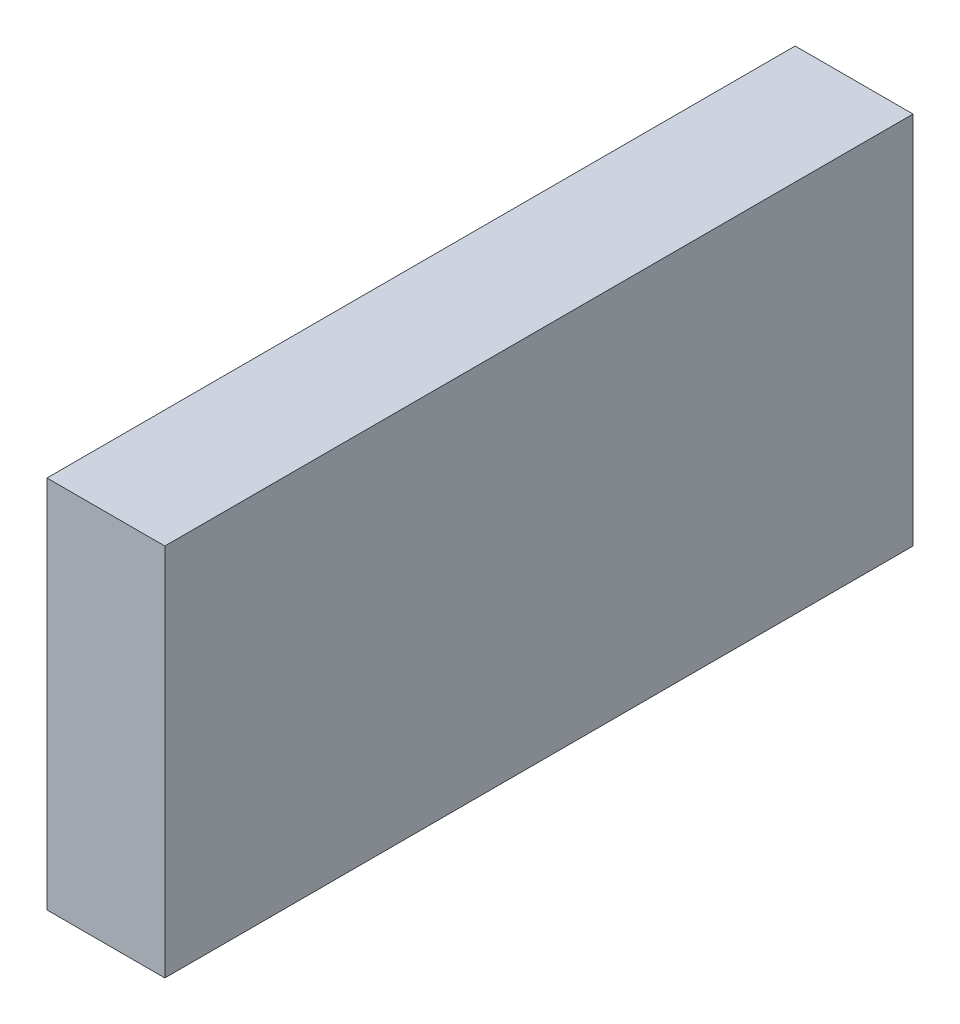
ISO-10303-21;
HEADER;
FILE_DESCRIPTION(('STEP AP214'),'2;1');
FILE_NAME('part.step','',(''),(''),'','','');
FILE_SCHEMA(('AUTOMOTIVE_DESIGN { 1 0 10303 214 1 1 1 1 }'));
ENDSEC;
DATA;
#1=APPLICATION_CONTEXT('core data for automotive mechanical design processes');
#2=APPLICATION_PROTOCOL_DEFINITION('international standard','automotive_design',2000,#1);
#3=PRODUCT_CONTEXT('',#1,'mechanical');
#4=PRODUCT('Part','Part','',(#3));
#5=PRODUCT_RELATED_PRODUCT_CATEGORY('part','',(#4));
#6=PRODUCT_DEFINITION_FORMATION('','',#4);
#7=PRODUCT_DEFINITION_CONTEXT('part definition',#1,'design');
#8=PRODUCT_DEFINITION('design','',#6,#7);
#9=PRODUCT_DEFINITION_SHAPE('','',#8);
#10=(LENGTH_UNIT() NAMED_UNIT(*) SI_UNIT(.MILLI.,.METRE.));
#11=(NAMED_UNIT(*) PLANE_ANGLE_UNIT() SI_UNIT($,.RADIAN.));
#12=(NAMED_UNIT(*) SI_UNIT($,.STERADIAN.) SOLID_ANGLE_UNIT());
#13=UNCERTAINTY_MEASURE_WITH_UNIT(LENGTH_MEASURE(1.E-05),#10,'distance_accuracy_value','');
#14=(GEOMETRIC_REPRESENTATION_CONTEXT(3) GLOBAL_UNCERTAINTY_ASSIGNED_CONTEXT((#13)) GLOBAL_UNIT_ASSIGNED_CONTEXT((#10,
#11,#12)) REPRESENTATION_CONTEXT('',''));
#15=CARTESIAN_POINT('',(0.,0.,0.));
#16=DIRECTION('',(0.,0.,1.));
#17=DIRECTION('',(1.,0.,0.));
#18=AXIS2_PLACEMENT_3D('',#15,#16,#17);
#19=CARTESIAN_POINT('',(6.3,0.,0.));
#20=DIRECTION('',(0.,0.,-1.));
#21=DIRECTION('',(-1.,0.,0.));
#22=AXIS2_PLACEMENT_3D('',#19,#20,#21);
#23=PLANE('',#22);
#24=DIRECTION('',(0.,-1.,0.));
#25=VECTOR('',#24,1.);
#26=CARTESIAN_POINT('',(0.,0.,0.));
#27=LINE('',#26,#25);
#28=CARTESIAN_POINT('',(0.,20.,0.));
#29=VERTEX_POINT('',#28);
#30=CARTESIAN_POINT('',(0.,0.,0.));
#31=VERTEX_POINT('',#30);
#32=EDGE_CURVE('E106',#29,#31,#27,.T.);
#33=ORIENTED_EDGE('',*,*,#32,.T.);
#34=DIRECTION('',(-1.,0.,0.));
#35=VECTOR('',#34,1.);
#36=CARTESIAN_POINT('',(6.3,0.,0.));
#37=LINE('',#36,#35);
#38=CARTESIAN_POINT('',(6.3,0.,0.));
#39=VERTEX_POINT('',#38);
#40=EDGE_CURVE('E11',#39,#31,#37,.T.);
#41=ORIENTED_EDGE('',*,*,#40,.F.);
#42=DIRECTION('',(0.,-1.,0.));
#43=VECTOR('',#42,1.);
#44=CARTESIAN_POINT('',(6.3,0.,0.));
#45=LINE('',#44,#43);
#46=CARTESIAN_POINT('',(6.3,20.,0.));
#47=VERTEX_POINT('',#46);
#48=EDGE_CURVE('E92',#47,#39,#45,.T.);
#49=ORIENTED_EDGE('',*,*,#48,.F.);
#50=DIRECTION('',(-1.,0.,0.));
#51=VECTOR('',#50,1.);
#52=CARTESIAN_POINT('',(6.3,20.,0.));
#53=LINE('',#52,#51);
#54=EDGE_CURVE('E105',#47,#29,#53,.T.);
#55=ORIENTED_EDGE('',*,*,#54,.T.);
#56=EDGE_LOOP('',(#33,#41,#49,#55));
#57=FACE_BOUND('',#56,.T.);
#58=ADVANCED_FACE('F43',(#57),#23,.F.);
#59=CARTESIAN_POINT('',(6.3,0.,0.));
#60=DIRECTION('',(0.,1.,0.));
#61=DIRECTION('',(0.,0.,1.));
#62=AXIS2_PLACEMENT_3D('',#59,#60,#61);
#63=PLANE('',#62);
#64=DIRECTION('',(0.,0.,-1.));
#65=VECTOR('',#64,1.);
#66=CARTESIAN_POINT('',(0.,0.,0.));
#67=LINE('',#66,#65);
#68=CARTESIAN_POINT('',(0.,0.,-40.));
#69=VERTEX_POINT('',#68);
#70=EDGE_CURVE('E97',#31,#69,#67,.T.);
#71=ORIENTED_EDGE('',*,*,#70,.T.);
#72=DIRECTION('',(-1.,0.,0.));
#73=VECTOR('',#72,1.);
#74=CARTESIAN_POINT('',(6.3,0.,-40.));
#75=LINE('',#74,#73);
#76=CARTESIAN_POINT('',(6.3,0.,-40.));
#77=VERTEX_POINT('',#76);
#78=EDGE_CURVE('E51',#77,#69,#75,.T.);
#79=ORIENTED_EDGE('',*,*,#78,.F.);
#80=DIRECTION('',(0.,0.,-1.));
#81=VECTOR('',#80,1.);
#82=CARTESIAN_POINT('',(6.3,0.,0.));
#83=LINE('',#82,#81);
#84=EDGE_CURVE('E87',#39,#77,#83,.T.);
#85=ORIENTED_EDGE('',*,*,#84,.F.);
#86=ORIENTED_EDGE('',*,*,#40,.T.);
#87=EDGE_LOOP('',(#71,#79,#85,#86));
#88=FACE_BOUND('',#87,.T.);
#89=ADVANCED_FACE('F100',(#88),#63,.F.);
#90=CARTESIAN_POINT('',(6.3,0.,-40.));
#91=DIRECTION('',(0.,0.,1.));
#92=DIRECTION('',(1.,0.,0.));
#93=AXIS2_PLACEMENT_3D('',#90,#91,#92);
#94=PLANE('',#93);
#95=DIRECTION('',(0.,1.,0.));
#96=VECTOR('',#95,1.);
#97=CARTESIAN_POINT('',(0.,0.,-40.));
#98=LINE('',#97,#96);
#99=CARTESIAN_POINT('',(0.,20.,-40.));
#100=VERTEX_POINT('',#99);
#101=EDGE_CURVE('E78',#69,#100,#98,.T.);
#102=ORIENTED_EDGE('',*,*,#101,.T.);
#103=DIRECTION('',(-1.,0.,0.));
#104=VECTOR('',#103,1.);
#105=CARTESIAN_POINT('',(6.3,20.,-40.));
#106=LINE('',#105,#104);
#107=CARTESIAN_POINT('',(6.3,20.,-40.));
#108=VERTEX_POINT('',#107);
#109=EDGE_CURVE('E98',#108,#100,#106,.T.);
#110=ORIENTED_EDGE('',*,*,#109,.F.);
#111=DIRECTION('',(0.,1.,0.));
#112=VECTOR('',#111,1.);
#113=CARTESIAN_POINT('',(6.3,0.,-40.));
#114=LINE('',#113,#112);
#115=EDGE_CURVE('E95',#77,#108,#114,.T.);
#116=ORIENTED_EDGE('',*,*,#115,.F.);
#117=ORIENTED_EDGE('',*,*,#78,.T.);
#118=EDGE_LOOP('',(#102,#110,#116,#117));
#119=FACE_BOUND('',#118,.T.);
#120=ADVANCED_FACE('F99',(#119),#94,.F.);
#121=CARTESIAN_POINT('',(6.3,20.,0.));
#122=DIRECTION('',(0.,-1.,0.));
#123=DIRECTION('',(0.,0.,-1.));
#124=AXIS2_PLACEMENT_3D('',#121,#122,#123);
#125=PLANE('',#124);
#126=DIRECTION('',(0.,0.,1.));
#127=VECTOR('',#126,1.);
#128=CARTESIAN_POINT('',(0.,20.,0.));
#129=LINE('',#128,#127);
#130=EDGE_CURVE('E85',#100,#29,#129,.T.);
#131=ORIENTED_EDGE('',*,*,#130,.T.);
#132=ORIENTED_EDGE('',*,*,#54,.F.);
#133=DIRECTION('',(0.,0.,1.));
#134=VECTOR('',#133,1.);
#135=CARTESIAN_POINT('',(6.3,20.,0.));
#136=LINE('',#135,#134);
#137=EDGE_CURVE('E56',#108,#47,#136,.T.);
#138=ORIENTED_EDGE('',*,*,#137,.F.);
#139=ORIENTED_EDGE('',*,*,#109,.T.);
#140=EDGE_LOOP('',(#131,#132,#138,#139));
#141=FACE_BOUND('',#140,.T.);
#142=ADVANCED_FACE('F111',(#141),#125,.F.);
#143=CARTESIAN_POINT('',(6.3,0.,0.));
#144=DIRECTION('',(-1.,0.,0.));
#145=DIRECTION('',(0.,0.,1.));
#146=AXIS2_PLACEMENT_3D('',#143,#144,#145);
#147=PLANE('',#146);
#148=ORIENTED_EDGE('',*,*,#48,.T.);
#149=ORIENTED_EDGE('',*,*,#84,.T.);
#150=ORIENTED_EDGE('',*,*,#115,.T.);
#151=ORIENTED_EDGE('',*,*,#137,.T.);
#152=EDGE_LOOP('',(#148,#149,#150,#151));
#153=FACE_BOUND('',#152,.T.);
#154=ADVANCED_FACE('F89',(#153),#147,.F.);
#155=CARTESIAN_POINT('',(0.,0.,0.));
#156=DIRECTION('',(-1.,0.,0.));
#157=DIRECTION('',(0.,0.,1.));
#158=AXIS2_PLACEMENT_3D('',#155,#156,#157);
#159=PLANE('',#158);
#160=ORIENTED_EDGE('',*,*,#32,.F.);
#161=ORIENTED_EDGE('',*,*,#130,.F.);
#162=ORIENTED_EDGE('',*,*,#101,.F.);
#163=ORIENTED_EDGE('',*,*,#70,.F.);
#164=EDGE_LOOP('',(#160,#161,#162,#163));
#165=FACE_BOUND('',#164,.T.);
#166=ADVANCED_FACE('F116',(#165),#159,.T.);
#167=CLOSED_SHELL('',(#58,#89,#120,#142,#154,#166));
#168=MANIFOLD_SOLID_BREP('B2',#167);
#169=ADVANCED_BREP_SHAPE_REPRESENTATION('',(#18,#168),#14);
#170=SHAPE_DEFINITION_REPRESENTATION(#9,#169);
ENDSEC;
END-ISO-10303-21;
